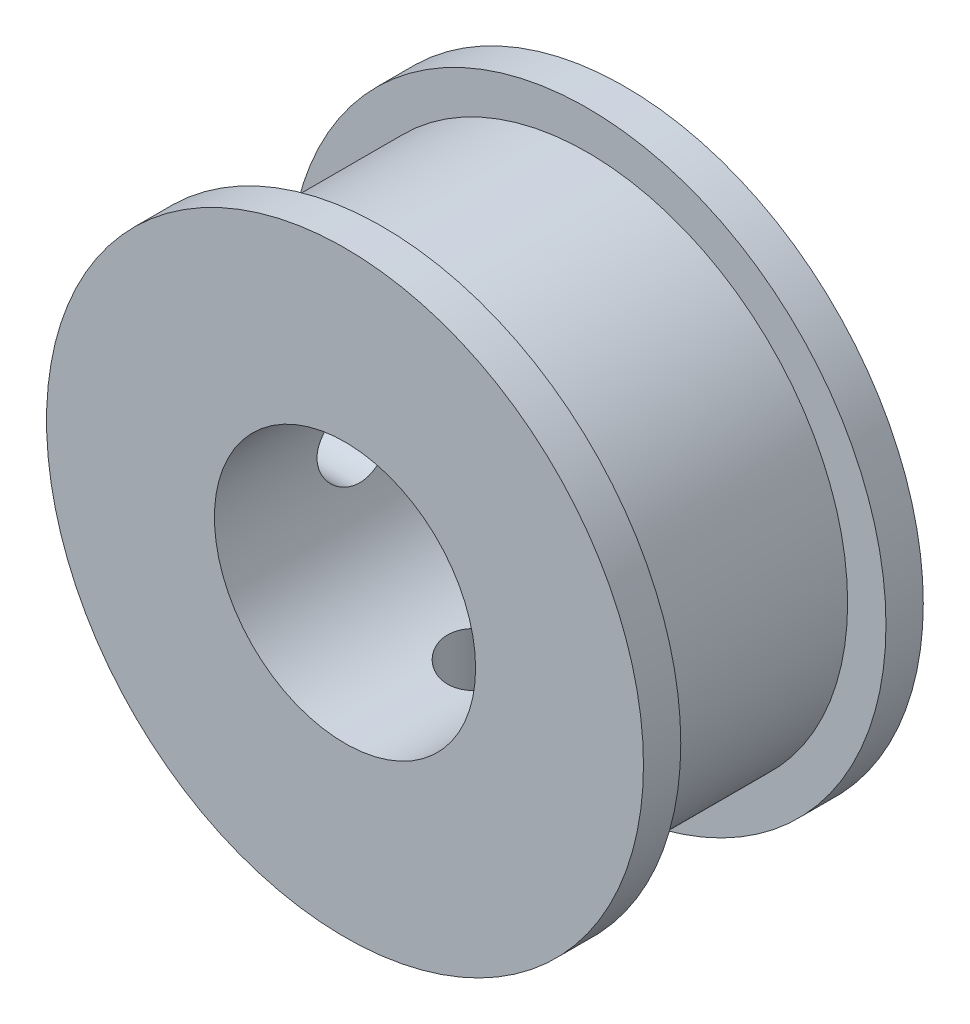
ISO-10303-21;
HEADER;
FILE_DESCRIPTION(('STEP AP214'),'2;1');
FILE_NAME('part.step','',(''),(''),'','','');
FILE_SCHEMA(('AUTOMOTIVE_DESIGN { 1 0 10303 214 1 1 1 1 }'));
ENDSEC;
DATA;
#1=APPLICATION_CONTEXT('core data for automotive mechanical design processes');
#2=APPLICATION_PROTOCOL_DEFINITION('international standard','automotive_design',2000,#1);
#3=PRODUCT_CONTEXT('',#1,'mechanical');
#4=PRODUCT('Part','Part','',(#3));
#5=PRODUCT_RELATED_PRODUCT_CATEGORY('part','',(#4));
#6=PRODUCT_DEFINITION_FORMATION('','',#4);
#7=PRODUCT_DEFINITION_CONTEXT('part definition',#1,'design');
#8=PRODUCT_DEFINITION('design','',#6,#7);
#9=PRODUCT_DEFINITION_SHAPE('','',#8);
#10=(LENGTH_UNIT() NAMED_UNIT(*) SI_UNIT(.MILLI.,.METRE.));
#11=(NAMED_UNIT(*) PLANE_ANGLE_UNIT() SI_UNIT($,.RADIAN.));
#12=(NAMED_UNIT(*) SI_UNIT($,.STERADIAN.) SOLID_ANGLE_UNIT());
#13=UNCERTAINTY_MEASURE_WITH_UNIT(LENGTH_MEASURE(1.E-05),#10,'distance_accuracy_value','');
#14=(GEOMETRIC_REPRESENTATION_CONTEXT(3) GLOBAL_UNCERTAINTY_ASSIGNED_CONTEXT((#13)) GLOBAL_UNIT_ASSIGNED_CONTEXT((#10,
#11,#12)) REPRESENTATION_CONTEXT('',''));
#15=CARTESIAN_POINT('',(0.,0.,0.));
#16=DIRECTION('',(0.,0.,1.));
#17=DIRECTION('',(1.,0.,0.));
#18=AXIS2_PLACEMENT_3D('',#15,#16,#17);
#19=CARTESIAN_POINT('',(0.,0.,2.));
#20=DIRECTION('',(0.,0.,-1.));
#21=DIRECTION('',(-1.,0.,0.));
#22=AXIS2_PLACEMENT_3D('',#19,#20,#21);
#23=CYLINDRICAL_SURFACE('',#22,16.);
#24=CARTESIAN_POINT('',(0.,0.,2.));
#25=DIRECTION('',(0.,0.,1.));
#26=DIRECTION('',(1.,0.,0.));
#27=AXIS2_PLACEMENT_3D('',#24,#25,#26);
#28=CIRCLE('',#27,16.);
#29=CARTESIAN_POINT('',(16.,0.,2.));
#30=VERTEX_POINT('',#29);
#31=EDGE_CURVE('E44',#30,#30,#28,.T.);
#32=ORIENTED_EDGE('',*,*,#31,.F.);
#33=EDGE_LOOP('',(#32));
#34=FACE_BOUND('',#33,.T.);
#35=CARTESIAN_POINT('',(0.,0.,0.));
#36=DIRECTION('',(0.,0.,1.));
#37=DIRECTION('',(1.,0.,0.));
#38=AXIS2_PLACEMENT_3D('',#35,#36,#37);
#39=CIRCLE('',#38,16.);
#40=CARTESIAN_POINT('',(16.,0.,0.));
#41=VERTEX_POINT('',#40);
#42=EDGE_CURVE('E49',#41,#41,#39,.T.);
#43=ORIENTED_EDGE('',*,*,#42,.T.);
#44=EDGE_LOOP('',(#43));
#45=FACE_BOUND('',#44,.T.);
#46=ADVANCED_FACE('F32',(#34,#45),#23,.T.);
#47=CARTESIAN_POINT('',(0.,0.,2.));
#48=DIRECTION('',(0.,0.,1.));
#49=DIRECTION('',(1.,0.,0.));
#50=AXIS2_PLACEMENT_3D('',#47,#48,#49);
#51=PLANE('',#50);
#52=CARTESIAN_POINT('',(0.,0.,2.));
#53=DIRECTION('',(0.,0.,1.));
#54=DIRECTION('',(1.,0.,0.));
#55=AXIS2_PLACEMENT_3D('',#52,#53,#54);
#56=CIRCLE('',#55,13.945);
#57=CARTESIAN_POINT('',(13.945,0.,2.));
#58=VERTEX_POINT('',#57);
#59=EDGE_CURVE('E10',#58,#58,#56,.T.);
#60=ORIENTED_EDGE('',*,*,#59,.F.);
#61=EDGE_LOOP('',(#60));
#62=FACE_BOUND('',#61,.T.);
#63=ORIENTED_EDGE('',*,*,#31,.T.);
#64=EDGE_LOOP('',(#63));
#65=FACE_BOUND('',#64,.T.);
#66=ADVANCED_FACE('F97',(#62,#65),#51,.T.);
#67=CARTESIAN_POINT('',(0.,0.,0.));
#68=DIRECTION('',(0.,0.,1.));
#69=DIRECTION('',(1.,0.,0.));
#70=AXIS2_PLACEMENT_3D('',#67,#68,#69);
#71=PLANE('',#70);
#72=CARTESIAN_POINT('',(0.,0.,0.));
#73=DIRECTION('',(0.,0.,1.));
#74=DIRECTION('',(1.,0.,0.));
#75=AXIS2_PLACEMENT_3D('',#72,#73,#74);
#76=CIRCLE('',#75,7.);
#77=CARTESIAN_POINT('',(7.,0.,0.));
#78=VERTEX_POINT('',#77);
#79=EDGE_CURVE('E86',#78,#78,#76,.T.);
#80=ORIENTED_EDGE('',*,*,#79,.T.);
#81=EDGE_LOOP('',(#80));
#82=FACE_BOUND('',#81,.T.);
#83=ORIENTED_EDGE('',*,*,#42,.F.);
#84=EDGE_LOOP('',(#83));
#85=FACE_BOUND('',#84,.T.);
#86=ADVANCED_FACE('F94',(#82,#85),#71,.F.);
#87=CARTESIAN_POINT('',(0.,0.,13.));
#88=DIRECTION('',(0.,0.,-1.));
#89=DIRECTION('',(-1.,0.,0.));
#90=AXIS2_PLACEMENT_3D('',#87,#88,#89);
#91=CYLINDRICAL_SURFACE('',#90,13.945);
#92=CARTESIAN_POINT('',(-13.945,0.,9.5));
#93=CARTESIAN_POINT('',(-13.9449982655467,-0.111725944881087,9.49999535043122));
#94=CARTESIAN_POINT('',(-13.9436431920022,-0.223518121905761,9.49060638937284));
#95=CARTESIAN_POINT('',(-13.9383679288523,-0.443981632184145,9.45330589604952));
#96=CARTESIAN_POINT('',(-13.9344451909274,-0.552649752951827,9.42537596210905));
#97=CARTESIAN_POINT('',(-13.9244757326362,-0.76364237886481,9.35184193419321));
#98=CARTESIAN_POINT('',(-13.9184305689848,-0.865971468897057,9.30625079148636));
#99=CARTESIAN_POINT('',(-13.9048854651112,-1.06151001299836,9.19871927063412));
#100=CARTESIAN_POINT('',(-13.897385740202,-1.15472081374425,9.13678131175586));
#101=CARTESIAN_POINT('',(-13.8817063382048,-1.3300616267768,8.99784094992483));
#102=CARTESIAN_POINT('',(-13.8735226128042,-1.41211682406785,8.92074457845407));
#103=CARTESIAN_POINT('',(-13.8574295164984,-1.5621720009626,8.75387800901321));
#104=CARTESIAN_POINT('',(-13.8495201608663,-1.63017119916254,8.66410710690485));
#105=CARTESIAN_POINT('',(-13.834831945192,-1.75047203324694,8.4739414372933));
#106=CARTESIAN_POINT('',(-13.8280583146169,-1.802701896444,8.37350082673225));
#107=CARTESIAN_POINT('',(-13.8164633174062,-1.88952287360959,8.16515971008703));
#108=CARTESIAN_POINT('',(-13.8116418535523,-1.9241148659692,8.05725957580174));
#109=CARTESIAN_POINT('',(-13.8045366341998,-1.97444713447729,7.83784652377838));
#110=CARTESIAN_POINT('',(-13.8022357044637,-1.99031504940842,7.72636345192361));
#111=CARTESIAN_POINT('',(-13.8003798364863,-2.00314401871672,7.50229496437047));
#112=CARTESIAN_POINT('',(-13.8008247539011,-2.00010606693928,7.38970960692779));
#113=CARTESIAN_POINT('',(-13.8043945997532,-1.97531397667889,7.167530664799));
#114=CARTESIAN_POINT('',(-13.8074992348458,-1.95370155530977,7.0579208935947));
#115=CARTESIAN_POINT('',(-13.8160070185916,-1.89259566227822,6.8438998341425));
#116=CARTESIAN_POINT('',(-13.8214102271404,-1.85310172466259,6.73948868143792));
#117=CARTESIAN_POINT('',(-13.8339289400293,-1.75720511736295,6.53839498345596));
#118=CARTESIAN_POINT('',(-13.8410505489524,-1.70074198532541,6.44174166675793));
#119=CARTESIAN_POINT('',(-13.8561991469752,-1.57255288207828,6.259227948228));
#120=CARTESIAN_POINT('',(-13.8642261904513,-1.50082599396734,6.17336819526388));
#121=CARTESIAN_POINT('',(-13.8803710383376,-1.34336543087744,6.01405715530256));
#122=CARTESIAN_POINT('',(-13.8884890021574,-1.2575098237008,5.94072634670625));
#123=CARTESIAN_POINT('',(-13.903832789545,-1.07464570955332,5.80949665037276));
#124=CARTESIAN_POINT('',(-13.9110586097879,-0.977637161018896,5.75159782014847));
#125=CARTESIAN_POINT('',(-13.9238105911513,-0.775119683667868,5.65287114178863));
#126=CARTESIAN_POINT('',(-13.9293358753501,-0.669606404455077,5.6120520973623));
#127=CARTESIAN_POINT('',(-13.9380567590545,-0.453125871305182,5.54874587133081));
#128=CARTESIAN_POINT('',(-13.9412525024255,-0.342158954619727,5.52625755766625));
#129=CARTESIAN_POINT('',(-13.9449352790098,-0.118961431261062,5.50041021912956));
#130=CARTESIAN_POINT('',(-13.9454457780248,-0.00675038897306506,5.49688546932927));
#131=CARTESIAN_POINT('',(-13.9437642773937,0.2166610480285,5.50862613849228));
#132=CARTESIAN_POINT('',(-13.9415723540364,0.32786147118233,5.52389102702867));
#133=CARTESIAN_POINT('',(-13.9347468235621,0.545596751155939,5.57263987951943));
#134=CARTESIAN_POINT('',(-13.9301239754049,0.65214994333569,5.60604358451257));
#135=CARTESIAN_POINT('',(-13.9189534759039,0.858143112440643,5.69003756030219));
#136=CARTESIAN_POINT('',(-13.9124057409701,0.957582780220601,5.74062857749002));
#137=CARTESIAN_POINT('',(-13.8980553366504,1.1472581199749,5.85795328605779));
#138=CARTESIAN_POINT('',(-13.8902445663647,1.23742778076889,5.92479268699532));
#139=CARTESIAN_POINT('',(-13.874264016036,1.4053289588581,6.0725690039025));
#140=CARTESIAN_POINT('',(-13.8660942170238,1.48305981794751,6.15350666541614));
#141=CARTESIAN_POINT('',(-13.8502425418994,1.6244757275981,6.32791763946523));
#142=CARTESIAN_POINT('',(-13.8425648264667,1.68805002357053,6.4214811890343));
#143=CARTESIAN_POINT('',(-13.8286388613517,1.79857964993521,6.61805623292917));
#144=CARTESIAN_POINT('',(-13.82239057571,1.84553539840802,6.72106748949248));
#145=CARTESIAN_POINT('',(-13.8120605902263,1.92132120964418,6.93327600223782));
#146=CARTESIAN_POINT('',(-13.8079717917124,1.95021071817875,7.04245166795921));
#147=CARTESIAN_POINT('',(-13.8024044544715,1.98923385843402,7.26416789677154));
#148=CARTESIAN_POINT('',(-13.8009257522239,1.99936866512387,7.37670824861832));
#149=CARTESIAN_POINT('',(-13.800751775432,2.00056854479561,7.60085595836024));
#150=CARTESIAN_POINT('',(-13.8020310901411,1.9918077107637,7.71246240387671));
#151=CARTESIAN_POINT('',(-13.8071739433262,1.95583683286525,7.93259771515098));
#152=CARTESIAN_POINT('',(-13.8110374790295,1.92862680879322,8.04112658421065));
#153=CARTESIAN_POINT('',(-13.8209048536763,1.85658955692229,8.25198480629022));
#154=CARTESIAN_POINT('',(-13.8269073413472,1.81177344985481,8.35431802574034));
#155=CARTESIAN_POINT('',(-13.8403780835011,1.70581339864733,8.55004085937553));
#156=CARTESIAN_POINT('',(-13.8478463789721,1.64466899790683,8.64343022335753));
#157=CARTESIAN_POINT('',(-13.8634893350983,1.50715159888151,8.81950052775766));
#158=CARTESIAN_POINT('',(-13.8716696306741,1.43064939160746,8.90208006101393));
#159=CARTESIAN_POINT('',(-13.8877670585951,1.26486070627031,9.05329221879918));
#160=CARTESIAN_POINT('',(-13.8956841291144,1.17557125053641,9.12192158582665));
#161=CARTESIAN_POINT('',(-13.9104080620764,0.986219027398785,9.24358924430717));
#162=CARTESIAN_POINT('',(-13.9172091614366,0.886104508435573,9.29654767147628));
#163=CARTESIAN_POINT('',(-13.9288779866587,0.678354067742358,9.38482020004785));
#164=CARTESIAN_POINT('',(-13.9337477415888,0.570726180147766,9.420152829212));
#165=CARTESIAN_POINT('',(-13.9398759727421,0.385494842989387,9.46403022878396));
#166=CARTESIAN_POINT('',(-13.9417877583291,0.309042203670669,9.47749862894637));
#167=CARTESIAN_POINT('',(-13.9443503670583,0.155070338741732,9.49548507955022));
#168=CARTESIAN_POINT('',(-13.9450012039173,0.0775511247432515,9.50000322735501));
#169=CARTESIAN_POINT('',(-13.945,0.,9.5));
#170=B_SPLINE_CURVE_WITH_KNOTS('',3,(#92,#93,#94,#95,#96,#97,#98,#99,#100,#101,#102,#103,#104,
#105,#106,#107,#108,#109,#110,#111,#112,#113,#114,#115,#116,#117,#118,#119,#120,#121,#122,#123,
#124,#125,#126,#127,#128,#129,#130,#131,#132,#133,#134,#135,#136,#137,#138,#139,#140,#141,#142,
#143,#144,#145,#146,#147,#148,#149,#150,#151,#152,#153,#154,#155,#156,#157,#158,#159,#160,#161,
#162,#163,#164,#165,#166,#167,#168,#169),.UNSPECIFIED.,.T.,.F.,(4,2,2,2,2,2,2,2,2,2,2,2,2,2,2,2,
2,2,2,2,2,2,2,2,2,2,2,2,2,2,2,2,2,2,2,2,2,2,4),(0.,0.334894486280671,0.670121848927922,
1.00510384751603,1.34003629780493,1.6771144996819,2.01421143543773,2.35282027784864,
2.69141225540951,3.02768252571801,3.36393511908837,3.69764476266522,4.03136310248575,
4.36628489115792,4.70122680442871,5.03922750672538,5.37722946868748,5.71540543846661,
6.05356052177335,6.38875556748366,6.72394115093624,7.05765557953602,7.39138450216532,
7.72734562512789,8.06332451977787,8.40184618887145,8.74035934101194,9.07775269481334,
9.41512491043806,9.74940206946978,10.0836788698493,10.4177448657622,10.7518202043955,
11.0888338092082,11.425926019848,11.764707691787,12.1031324912221,12.335591716681,
12.5680484133688),.UNSPECIFIED.);
#171=CARTESIAN_POINT('',(-13.945,0.,9.5));
#172=VERTEX_POINT('',#171);
#173=EDGE_CURVE('E63',#172,#172,#170,.T.);
#174=ORIENTED_EDGE('',*,*,#173,.T.);
#175=EDGE_LOOP('',(#174));
#176=FACE_BOUND('',#175,.T.);
#177=CARTESIAN_POINT('',(0.,-13.945,9.5));
#178=CARTESIAN_POINT('',(0.111725944881087,-13.9449982655467,9.49999535043122));
#179=CARTESIAN_POINT('',(0.223518121905761,-13.9436431920022,9.49060638937284));
#180=CARTESIAN_POINT('',(0.443981632184145,-13.9383679288523,9.45330589604952));
#181=CARTESIAN_POINT('',(0.552649752951827,-13.9344451909274,9.42537596210905));
#182=CARTESIAN_POINT('',(0.763642378864811,-13.9244757326362,9.35184193419321));
#183=CARTESIAN_POINT('',(0.865971468897056,-13.9184305689848,9.30625079148636));
#184=CARTESIAN_POINT('',(1.06151001299836,-13.9048854651112,9.19871927063412));
#185=CARTESIAN_POINT('',(1.15472081374425,-13.897385740202,9.13678131175586));
#186=CARTESIAN_POINT('',(1.3300616267768,-13.8817063382048,8.99784094992483));
#187=CARTESIAN_POINT('',(1.41211682406784,-13.8735226128042,8.92074457845407));
#188=CARTESIAN_POINT('',(1.5621720009626,-13.8574295164984,8.75387800901321));
#189=CARTESIAN_POINT('',(1.63017119916254,-13.8495201608663,8.66410710690485));
#190=CARTESIAN_POINT('',(1.75047203324694,-13.834831945192,8.4739414372933));
#191=CARTESIAN_POINT('',(1.802701896444,-13.8280583146169,8.37350082673225));
#192=CARTESIAN_POINT('',(1.88952287360959,-13.8164633174062,8.16515971008703));
#193=CARTESIAN_POINT('',(1.9241148659692,-13.8116418535523,8.05725957580175));
#194=CARTESIAN_POINT('',(1.97444713447729,-13.8045366341998,7.83784652377838));
#195=CARTESIAN_POINT('',(1.99031504940842,-13.8022357044637,7.72636345192361));
#196=CARTESIAN_POINT('',(2.00314401871672,-13.8003798364863,7.50229496437047));
#197=CARTESIAN_POINT('',(2.00010606693928,-13.8008247539011,7.38970960692779));
#198=CARTESIAN_POINT('',(1.97531397667889,-13.8043945997532,7.167530664799));
#199=CARTESIAN_POINT('',(1.95370155530977,-13.8074992348458,7.0579208935947));
#200=CARTESIAN_POINT('',(1.89259566227822,-13.8160070185916,6.8438998341425));
#201=CARTESIAN_POINT('',(1.85310172466259,-13.8214102271404,6.73948868143792));
#202=CARTESIAN_POINT('',(1.75720511736295,-13.8339289400293,6.53839498345596));
#203=CARTESIAN_POINT('',(1.70074198532541,-13.8410505489524,6.44174166675793));
#204=CARTESIAN_POINT('',(1.57255288207828,-13.8561991469752,6.259227948228));
#205=CARTESIAN_POINT('',(1.50082599396734,-13.8642261904513,6.17336819526388));
#206=CARTESIAN_POINT('',(1.34336543087744,-13.8803710383376,6.01405715530256));
#207=CARTESIAN_POINT('',(1.2575098237008,-13.8884890021574,5.94072634670625));
#208=CARTESIAN_POINT('',(1.07464570955332,-13.903832789545,5.80949665037276));
#209=CARTESIAN_POINT('',(0.977637161018895,-13.9110586097879,5.75159782014847));
#210=CARTESIAN_POINT('',(0.775119683667867,-13.9238105911513,5.65287114178863));
#211=CARTESIAN_POINT('',(0.669606404455077,-13.9293358753501,5.6120520973623));
#212=CARTESIAN_POINT('',(0.453125871305181,-13.9380567590545,5.54874587133081));
#213=CARTESIAN_POINT('',(0.342158954619726,-13.9412525024255,5.52625755766625));
#214=CARTESIAN_POINT('',(0.118961431261061,-13.9449352790098,5.50041021912956));
#215=CARTESIAN_POINT('',(0.00675038897306411,-13.9454457780248,5.49688546932927));
#216=CARTESIAN_POINT('',(-0.216661048028501,-13.9437642773937,5.50862613849228));
#217=CARTESIAN_POINT('',(-0.32786147118233,-13.9415723540364,5.52389102702867));
#218=CARTESIAN_POINT('',(-0.545596751155938,-13.9347468235621,5.57263987951943));
#219=CARTESIAN_POINT('',(-0.652149943335689,-13.9301239754049,5.60604358451257));
#220=CARTESIAN_POINT('',(-0.858143112440642,-13.9189534759039,5.69003756030219));
#221=CARTESIAN_POINT('',(-0.9575827802206,-13.9124057409701,5.74062857749002));
#222=CARTESIAN_POINT('',(-1.1472581199749,-13.8980553366504,5.85795328605779));
#223=CARTESIAN_POINT('',(-1.23742778076889,-13.8902445663647,5.92479268699532));
#224=CARTESIAN_POINT('',(-1.4053289588581,-13.874264016036,6.0725690039025));
#225=CARTESIAN_POINT('',(-1.48305981794751,-13.8660942170238,6.15350666541614));
#226=CARTESIAN_POINT('',(-1.6244757275981,-13.8502425418994,6.32791763946523));
#227=CARTESIAN_POINT('',(-1.68805002357053,-13.8425648264667,6.4214811890343));
#228=CARTESIAN_POINT('',(-1.79857964993521,-13.8286388613517,6.61805623292917));
#229=CARTESIAN_POINT('',(-1.84553539840802,-13.82239057571,6.72106748949248));
#230=CARTESIAN_POINT('',(-1.92132120964418,-13.8120605902263,6.93327600223782));
#231=CARTESIAN_POINT('',(-1.95021071817875,-13.8079717917124,7.04245166795921));
#232=CARTESIAN_POINT('',(-1.98923385843402,-13.8024044544715,7.26416789677155));
#233=CARTESIAN_POINT('',(-1.99936866512387,-13.8009257522239,7.37670824861832));
#234=CARTESIAN_POINT('',(-2.00056854479561,-13.800751775432,7.60085595836024));
#235=CARTESIAN_POINT('',(-1.9918077107637,-13.8020310901411,7.71246240387671));
#236=CARTESIAN_POINT('',(-1.95583683286525,-13.8071739433262,7.93259771515098));
#237=CARTESIAN_POINT('',(-1.92862680879322,-13.8110374790295,8.04112658421065));
#238=CARTESIAN_POINT('',(-1.85658955692229,-13.8209048536763,8.25198480629022));
#239=CARTESIAN_POINT('',(-1.81177344985481,-13.8269073413472,8.35431802574033));
#240=CARTESIAN_POINT('',(-1.70581339864734,-13.8403780835011,8.55004085937553));
#241=CARTESIAN_POINT('',(-1.64466899790683,-13.8478463789721,8.64343022335753));
#242=CARTESIAN_POINT('',(-1.50715159888151,-13.8634893350983,8.81950052775766));
#243=CARTESIAN_POINT('',(-1.43064939160746,-13.8716696306741,8.90208006101393));
#244=CARTESIAN_POINT('',(-1.26486070627031,-13.8877670585951,9.05329221879918));
#245=CARTESIAN_POINT('',(-1.17557125053641,-13.8956841291144,9.12192158582665));
#246=CARTESIAN_POINT('',(-0.986219027398784,-13.9104080620764,9.24358924430717));
#247=CARTESIAN_POINT('',(-0.886104508435573,-13.9172091614366,9.29654767147628));
#248=CARTESIAN_POINT('',(-0.678354067742358,-13.9288779866587,9.38482020004785));
#249=CARTESIAN_POINT('',(-0.570726180147766,-13.9337477415888,9.420152829212));
#250=CARTESIAN_POINT('',(-0.385494842989387,-13.9398759727421,9.46403022878395));
#251=CARTESIAN_POINT('',(-0.309042203670669,-13.9417877583291,9.47749862894637));
#252=CARTESIAN_POINT('',(-0.155070338741732,-13.9443503670583,9.49548507955022));
#253=CARTESIAN_POINT('',(-0.0775511247432517,-13.9450012039173,9.50000322735501));
#254=CARTESIAN_POINT('',(0.,-13.945,9.5));
#255=B_SPLINE_CURVE_WITH_KNOTS('',3,(#177,#178,#179,#180,#181,#182,#183,#184,#185,#186,#187,
#188,#189,#190,#191,#192,#193,#194,#195,#196,#197,#198,#199,#200,#201,#202,#203,#204,#205,#206,
#207,#208,#209,#210,#211,#212,#213,#214,#215,#216,#217,#218,#219,#220,#221,#222,#223,#224,#225,
#226,#227,#228,#229,#230,#231,#232,#233,#234,#235,#236,#237,#238,#239,#240,#241,#242,#243,#244,
#245,#246,#247,#248,#249,#250,#251,#252,#253,#254),.UNSPECIFIED.,.T.,.F.,(4,2,2,2,2,2,2,2,2,2,2,
2,2,2,2,2,2,2,2,2,2,2,2,2,2,2,2,2,2,2,2,2,2,2,2,2,2,2,4),(0.,0.334894486280671,
0.670121848927922,1.00510384751603,1.34003629780493,1.6771144996819,2.01421143543773,
2.35282027784864,2.69141225540951,3.02768252571801,3.36393511908837,3.69764476266522,
4.03136310248575,4.36628489115792,4.70122680442871,5.03922750672538,5.37722946868748,
5.71540543846661,6.05356052177335,6.38875556748366,6.72394115093624,7.05765557953602,
7.39138450216532,7.72734562512789,8.06332451977787,8.40184618887145,8.74035934101194,
9.07775269481334,9.41512491043806,9.74940206946978,10.0836788698493,10.4177448657622,
10.7518202043955,11.0888338092082,11.425926019848,11.764707691787,12.1031324912221,
12.335591716681,12.5680484133688),.UNSPECIFIED.);
#256=CARTESIAN_POINT('',(0.,-13.945,9.5));
#257=VERTEX_POINT('',#256);
#258=EDGE_CURVE('E62',#257,#257,#255,.T.);
#259=ORIENTED_EDGE('',*,*,#258,.T.);
#260=EDGE_LOOP('',(#259));
#261=FACE_BOUND('',#260,.T.);
#262=CARTESIAN_POINT('',(0.,0.,13.));
#263=DIRECTION('',(0.,0.,1.));
#264=DIRECTION('',(1.,0.,0.));
#265=AXIS2_PLACEMENT_3D('',#262,#263,#264);
#266=CIRCLE('',#265,13.945);
#267=CARTESIAN_POINT('',(13.945,0.,13.));
#268=VERTEX_POINT('',#267);
#269=EDGE_CURVE('E52',#268,#268,#266,.T.);
#270=ORIENTED_EDGE('',*,*,#269,.F.);
#271=EDGE_LOOP('',(#270));
#272=FACE_BOUND('',#271,.T.);
#273=ORIENTED_EDGE('',*,*,#59,.T.);
#274=EDGE_LOOP('',(#273));
#275=FACE_BOUND('',#274,.T.);
#276=ADVANCED_FACE('F88',(#176,#261,#272,#275),#91,.T.);
#277=CARTESIAN_POINT('',(0.,0.,15.));
#278=DIRECTION('',(0.,0.,-1.));
#279=DIRECTION('',(-1.,0.,0.));
#280=AXIS2_PLACEMENT_3D('',#277,#278,#279);
#281=CYLINDRICAL_SURFACE('',#280,16.);
#282=CARTESIAN_POINT('',(0.,0.,15.));
#283=DIRECTION('',(0.,0.,1.));
#284=DIRECTION('',(1.,0.,0.));
#285=AXIS2_PLACEMENT_3D('',#282,#283,#284);
#286=CIRCLE('',#285,16.);
#287=CARTESIAN_POINT('',(16.,0.,15.));
#288=VERTEX_POINT('',#287);
#289=EDGE_CURVE('E195',#288,#288,#286,.T.);
#290=ORIENTED_EDGE('',*,*,#289,.F.);
#291=EDGE_LOOP('',(#290));
#292=FACE_BOUND('',#291,.T.);
#293=CARTESIAN_POINT('',(0.,0.,13.));
#294=DIRECTION('',(0.,0.,1.));
#295=DIRECTION('',(1.,0.,0.));
#296=AXIS2_PLACEMENT_3D('',#293,#294,#295);
#297=CIRCLE('',#296,16.);
#298=CARTESIAN_POINT('',(16.,0.,13.));
#299=VERTEX_POINT('',#298);
#300=EDGE_CURVE('E193',#299,#299,#297,.T.);
#301=ORIENTED_EDGE('',*,*,#300,.T.);
#302=EDGE_LOOP('',(#301));
#303=FACE_BOUND('',#302,.T.);
#304=ADVANCED_FACE('F93',(#292,#303),#281,.T.);
#305=CARTESIAN_POINT('',(0.,0.,15.));
#306=DIRECTION('',(0.,0.,1.));
#307=DIRECTION('',(1.,0.,0.));
#308=AXIS2_PLACEMENT_3D('',#305,#306,#307);
#309=PLANE('',#308);
#310=CARTESIAN_POINT('',(0.,0.,15.));
#311=DIRECTION('',(0.,0.,1.));
#312=DIRECTION('',(1.,0.,0.));
#313=AXIS2_PLACEMENT_3D('',#310,#311,#312);
#314=CIRCLE('',#313,7.);
#315=CARTESIAN_POINT('',(7.,0.,15.));
#316=VERTEX_POINT('',#315);
#317=EDGE_CURVE('E82',#316,#316,#314,.T.);
#318=ORIENTED_EDGE('',*,*,#317,.F.);
#319=EDGE_LOOP('',(#318));
#320=FACE_BOUND('',#319,.T.);
#321=ORIENTED_EDGE('',*,*,#289,.T.);
#322=EDGE_LOOP('',(#321));
#323=FACE_BOUND('',#322,.T.);
#324=ADVANCED_FACE('F129',(#320,#323),#309,.T.);
#325=CARTESIAN_POINT('',(0.,0.,13.));
#326=DIRECTION('',(0.,0.,1.));
#327=DIRECTION('',(1.,0.,0.));
#328=AXIS2_PLACEMENT_3D('',#325,#326,#327);
#329=PLANE('',#328);
#330=ORIENTED_EDGE('',*,*,#269,.T.);
#331=EDGE_LOOP('',(#330));
#332=FACE_BOUND('',#331,.T.);
#333=ORIENTED_EDGE('',*,*,#300,.F.);
#334=EDGE_LOOP('',(#333));
#335=FACE_BOUND('',#334,.T.);
#336=ADVANCED_FACE('F137',(#332,#335),#329,.F.);
#337=CARTESIAN_POINT('',(0.,0.,0.));
#338=DIRECTION('',(0.,0.,1.));
#339=DIRECTION('',(1.,0.,0.));
#340=AXIS2_PLACEMENT_3D('',#337,#338,#339);
#341=CYLINDRICAL_SURFACE('',#340,7.);
#342=CARTESIAN_POINT('',(-7.,0.,5.5));
#343=CARTESIAN_POINT('',(-6.99999869294341,-0.109954902377251,5.50000193956195));
#344=CARTESIAN_POINT('',(-6.99738417402043,-0.219929747872582,5.50909778897611));
#345=CARTESIAN_POINT('',(-6.98720905945103,-0.436691991196989,5.54516427010231));
#346=CARTESIAN_POINT('',(-6.97964659210084,-0.543478166829615,5.57214166607409));
#347=CARTESIAN_POINT('',(-6.96040691349073,-0.750704300737871,5.6430080384165));
#348=CARTESIAN_POINT('',(-6.94873544106341,-0.851152880848224,5.68687343615195));
#349=CARTESIAN_POINT('',(-6.92249978316544,-1.04326876112927,5.79017799147835));
#350=CARTESIAN_POINT('',(-6.90793529508022,-1.13493514117816,5.84961877849036));
#351=CARTESIAN_POINT('',(-6.8770473462558,-1.30929444685894,5.98403501067291));
#352=CARTESIAN_POINT('',(-6.86069041945191,-1.39172372238094,6.05934475385527));
#353=CARTESIAN_POINT('',(-6.82826734915641,-1.54297135792435,6.22264774313768));
#354=CARTESIAN_POINT('',(-6.81220124959344,-1.61178767707782,6.31064288763223));
#355=CARTESIAN_POINT('',(-6.78183014875388,-1.7351979000643,6.49899358279091));
#356=CARTESIAN_POINT('',(-6.76756702506018,-1.78947821103348,6.59956198506486));
#357=CARTESIAN_POINT('',(-6.74291343840667,-1.8802517055398,6.80887201175076));
#358=CARTESIAN_POINT('',(-6.73252214244871,-1.91674871555719,6.91761187207089));
#359=CARTESIAN_POINT('',(-6.71713608196016,-1.96998433013875,7.13723476316554));
#360=CARTESIAN_POINT('',(-6.71200978570011,-1.9872055320285,7.24799136276783));
#361=CARTESIAN_POINT('',(-6.70734208201995,-2.00290667789184,7.4709311484461));
#362=CARTESIAN_POINT('',(-6.70779946107612,-2.00139069409621,7.58311401925022));
#363=CARTESIAN_POINT('',(-6.71413034409934,-1.98004134762903,7.80186861145616));
#364=CARTESIAN_POINT('',(-6.71982782697936,-1.96080325728391,7.90850435118076));
#365=CARTESIAN_POINT('',(-6.73571348382811,-1.90551386085789,8.1169672196276));
#366=CARTESIAN_POINT('',(-6.74590206376403,-1.8694610348125,8.2187939127205));
#367=CARTESIAN_POINT('',(-6.7697686351608,-1.78110681137812,8.41624624443181));
#368=CARTESIAN_POINT('',(-6.78348916405649,-1.72860551172881,8.51177707240167));
#369=CARTESIAN_POINT('',(-6.81285216882059,-1.60898379167885,8.69287656121341));
#370=CARTESIAN_POINT('',(-6.82849507221912,-1.54186011673345,8.77844299773491));
#371=CARTESIAN_POINT('',(-6.86066250656356,-1.39190399673021,8.94057237560637));
#372=CARTESIAN_POINT('',(-6.87719804572366,-1.30857487484533,9.01667447596723));
#373=CARTESIAN_POINT('',(-6.90876247218345,-1.13013228238622,9.15392600364028));
#374=CARTESIAN_POINT('',(-6.92379128137825,-1.03501820148189,9.21507465604171));
#375=CARTESIAN_POINT('',(-6.95076528065502,-0.834923073091444,9.32092873477404));
#376=CARTESIAN_POINT('',(-6.96269275497229,-0.729889817810004,9.36554028680419));
#377=CARTESIAN_POINT('',(-6.98199251487585,-0.513393229967469,9.43633389141682));
#378=CARTESIAN_POINT('',(-6.98936594856255,-0.401931525810146,9.46252058924527));
#379=CARTESIAN_POINT('',(-6.99854874514672,-0.17966638864435,9.49497328570945));
#380=CARTESIAN_POINT('',(-7.00053272850599,-0.0689613468605083,9.50186469537303));
#381=CARTESIAN_POINT('',(-6.99922084707091,0.152026526805583,9.49727273369896));
#382=CARTESIAN_POINT('',(-6.99592561580629,0.262309407757108,9.48579156715408));
#383=CARTESIAN_POINT('',(-6.98453926685206,0.477018633430315,9.44528955568375));
#384=CARTESIAN_POINT('',(-6.97654613017679,0.581518211734843,9.41662681867661));
#385=CARTESIAN_POINT('',(-6.95667998741883,0.784208686205641,9.34299949801533));
#386=CARTESIAN_POINT('',(-6.94480653265874,0.882398851248718,9.29803302911067));
#387=CARTESIAN_POINT('',(-6.91809961169145,1.07204168512003,9.19197666335488));
#388=CARTESIAN_POINT('',(-6.9032076317834,1.16330248654009,9.13055880117467));
#389=CARTESIAN_POINT('',(-6.87217947098441,1.33443852805947,8.9937474940489));
#390=CARTESIAN_POINT('',(-6.85604300755107,1.41431117084304,8.91835086993543));
#391=CARTESIAN_POINT('',(-6.82368619629443,1.56310642834007,8.75279065795056));
#392=CARTESIAN_POINT('',(-6.80748036858305,1.63158542740713,8.66222472444096));
#393=CARTESIAN_POINT('',(-6.77738894734787,1.75239531606757,8.47053741137533));
#394=CARTESIAN_POINT('',(-6.76350327310608,1.8047267674867,8.36941639922874));
#395=CARTESIAN_POINT('',(-6.73978651242836,1.89137454118278,8.15990878902478));
#396=CARTESIAN_POINT('',(-6.72993400029434,1.92578633239654,8.05156423650238));
#397=CARTESIAN_POINT('',(-6.71542456669526,1.9757945006787,7.83029006442521));
#398=CARTESIAN_POINT('',(-6.71076607094366,1.99139657901587,7.71736184492359));
#399=CARTESIAN_POINT('',(-6.70731703127619,2.00298024246851,7.49470396706322));
#400=CARTESIAN_POINT('',(-6.70831160808103,1.99968027644405,7.38501449544334));
#401=CARTESIAN_POINT('',(-6.71554597206102,1.97524710957466,7.16782526933831));
#402=CARTESIAN_POINT('',(-6.72178558421114,1.95411450379873,7.06032544190808));
#403=CARTESIAN_POINT('',(-6.73866977160527,1.89505968816675,6.8516216288314));
#404=CARTESIAN_POINT('',(-6.74926877048974,1.85731091786365,6.75036461298883));
#405=CARTESIAN_POINT('',(-6.77367302842112,1.76622949301581,6.55554126550781));
#406=CARTESIAN_POINT('',(-6.78747885482392,1.71289408043152,6.46197629872677));
#407=CARTESIAN_POINT('',(-6.81731668949935,1.59006546534828,6.28181647819467));
#408=CARTESIAN_POINT('',(-6.83340763179064,1.52009227722732,6.19555860865804));
#409=CARTESIAN_POINT('',(-6.86569845092232,1.36685984037935,6.03577610419019));
#410=CARTESIAN_POINT('',(-6.88189835417168,1.28359725072856,5.9622546808892));
#411=CARTESIAN_POINT('',(-6.91307959572365,1.10357432086539,5.82816281567338));
#412=CARTESIAN_POINT('',(-6.92801901037413,1.00652250235978,5.76797301273037));
#413=CARTESIAN_POINT('',(-6.95451395777971,0.803250529646661,5.66485421497799));
#414=CARTESIAN_POINT('',(-6.96607133870287,0.697035424114739,5.62191578806694));
#415=CARTESIAN_POINT('',(-6.98327344725308,0.492916315335035,5.55915244860455));
#416=CARTESIAN_POINT('',(-6.98949684362076,0.395763007624391,5.53702646331544));
#417=CARTESIAN_POINT('',(-6.99786043852147,0.199078368786368,5.50745034275786));
#418=CARTESIAN_POINT('',(-7.00000118333996,0.0995473576160921,5.49999824402312));
#419=CARTESIAN_POINT('',(-7.,0.,5.5));
#420=B_SPLINE_CURVE_WITH_KNOTS('',3,(#342,#343,#344,#345,#346,#347,#348,#349,#350,#351,#352,
#353,#354,#355,#356,#357,#358,#359,#360,#361,#362,#363,#364,#365,#366,#367,#368,#369,#370,#371,
#372,#373,#374,#375,#376,#377,#378,#379,#380,#381,#382,#383,#384,#385,#386,#387,#388,#389,#390,
#391,#392,#393,#394,#395,#396,#397,#398,#399,#400,#401,#402,#403,#404,#405,#406,#407,#408,#409,
#410,#411,#412,#413,#414,#415,#416,#417,#418,#419),.UNSPECIFIED.,.T.,.F.,(4,2,2,2,2,2,2,2,2,2,2,
2,2,2,2,2,2,2,2,2,2,2,2,2,2,2,2,2,2,2,2,2,2,2,2,2,2,2,4),(0.,0.329499312542344,0.65912333979518,
0.988288812895343,1.31748873543516,1.65447811530781,1.99151797873713,2.33533075300057,
2.67906951544809,3.0139950986275,3.34884789231233,3.67284785829333,3.99687711786126,
4.3250080329121,4.65321205577343,4.99378500602502,5.33437560155449,5.67687101104449,
6.01928004014612,6.35045457698201,6.68158937434649,7.0060514047952,7.33055096575529,
7.66207525344452,7.99367503187788,8.33612104884334,8.67855514965298,9.01914573366139,
9.35963305787734,9.68726681616472,10.0148896418598,10.3391709629126,10.6635096999758,
10.9986765689036,11.3339278310847,11.6777797897016,12.0214434923409,12.3197946803794,
12.6181059442772),.UNSPECIFIED.);
#421=CARTESIAN_POINT('',(-7.,0.,5.5));
#422=VERTEX_POINT('',#421);
#423=EDGE_CURVE('E35',#422,#422,#420,.T.);
#424=ORIENTED_EDGE('',*,*,#423,.T.);
#425=EDGE_LOOP('',(#424));
#426=FACE_BOUND('',#425,.T.);
#427=CARTESIAN_POINT('',(0.,-7.,9.5));
#428=CARTESIAN_POINT('',(-0.109954902377251,-6.99999869294341,9.49999806043805));
#429=CARTESIAN_POINT('',(-0.219929747872582,-6.99738417402043,9.49090221102388));
#430=CARTESIAN_POINT('',(-0.436691991196989,-6.98720905945103,9.45483572989769));
#431=CARTESIAN_POINT('',(-0.543478166829616,-6.97964659210084,9.42785833392591));
#432=CARTESIAN_POINT('',(-0.750704300737871,-6.96040691349073,9.35699196158349));
#433=CARTESIAN_POINT('',(-0.851152880848224,-6.94873544106341,9.31312656384805));
#434=CARTESIAN_POINT('',(-1.04326876112927,-6.92249978316544,9.20982200852165));
#435=CARTESIAN_POINT('',(-1.13493514117817,-6.90793529508022,9.15038122150964));
#436=CARTESIAN_POINT('',(-1.30929444685895,-6.8770473462558,9.01596498932709));
#437=CARTESIAN_POINT('',(-1.39172372238094,-6.86069041945191,8.94065524614473));
#438=CARTESIAN_POINT('',(-1.54297135792435,-6.82826734915641,8.77735225686232));
#439=CARTESIAN_POINT('',(-1.61178767707782,-6.81220124959344,8.68935711236777));
#440=CARTESIAN_POINT('',(-1.7351979000643,-6.78183014875388,8.50100641720909));
#441=CARTESIAN_POINT('',(-1.78947821103348,-6.76756702506018,8.40043801493514));
#442=CARTESIAN_POINT('',(-1.8802517055398,-6.74291343840667,8.19112798824924));
#443=CARTESIAN_POINT('',(-1.91674871555719,-6.73252214244871,8.08238812792911));
#444=CARTESIAN_POINT('',(-1.96998433013875,-6.71713608196016,7.86276523683446));
#445=CARTESIAN_POINT('',(-1.9872055320285,-6.71200978570011,7.75200863723217));
#446=CARTESIAN_POINT('',(-2.00290667789184,-6.70734208201995,7.5290688515539));
#447=CARTESIAN_POINT('',(-2.00139069409621,-6.70779946107612,7.41688598074978));
#448=CARTESIAN_POINT('',(-1.98004134762903,-6.71413034409934,7.19813138854384));
#449=CARTESIAN_POINT('',(-1.96080325728391,-6.71982782697936,7.09149564881924));
#450=CARTESIAN_POINT('',(-1.90551386085789,-6.73571348382811,6.8830327803724));
#451=CARTESIAN_POINT('',(-1.8694610348125,-6.74590206376403,6.7812060872795));
#452=CARTESIAN_POINT('',(-1.78110681137812,-6.7697686351608,6.58375375556819));
#453=CARTESIAN_POINT('',(-1.72860551172881,-6.78348916405649,6.48822292759833));
#454=CARTESIAN_POINT('',(-1.60898379167885,-6.81285216882059,6.30712343878659));
#455=CARTESIAN_POINT('',(-1.54186011673345,-6.82849507221912,6.22155700226509));
#456=CARTESIAN_POINT('',(-1.39190399673021,-6.86066250656356,6.05942762439363));
#457=CARTESIAN_POINT('',(-1.30857487484533,-6.87719804572366,5.98332552403277));
#458=CARTESIAN_POINT('',(-1.13013228238622,-6.90876247218345,5.84607399635972));
#459=CARTESIAN_POINT('',(-1.03501820148189,-6.92379128137825,5.78492534395829));
#460=CARTESIAN_POINT('',(-0.834923073091445,-6.95076528065502,5.67907126522596));
#461=CARTESIAN_POINT('',(-0.729889817810004,-6.96269275497229,5.63445971319581));
#462=CARTESIAN_POINT('',(-0.513393229967468,-6.98199251487585,5.56366610858318));
#463=CARTESIAN_POINT('',(-0.401931525810145,-6.98936594856255,5.53747941075473));
#464=CARTESIAN_POINT('',(-0.179666388644349,-6.99854874514672,5.50502671429055));
#465=CARTESIAN_POINT('',(-0.068961346860507,-7.00053272850599,5.49813530462697));
#466=CARTESIAN_POINT('',(0.152026526805584,-6.99922084707091,5.50272726630104));
#467=CARTESIAN_POINT('',(0.262309407757109,-6.99592561580629,5.51420843284592));
#468=CARTESIAN_POINT('',(0.477018633430316,-6.98453926685206,5.55471044431625));
#469=CARTESIAN_POINT('',(0.581518211734844,-6.97654613017679,5.58337318132339));
#470=CARTESIAN_POINT('',(0.784208686205641,-6.95667998741883,5.65700050198467));
#471=CARTESIAN_POINT('',(0.882398851248718,-6.94480653265874,5.70196697088933));
#472=CARTESIAN_POINT('',(1.07204168512003,-6.91809961169145,5.80802333664512));
#473=CARTESIAN_POINT('',(1.16330248654009,-6.9032076317834,5.86944119882533));
#474=CARTESIAN_POINT('',(1.33443852805947,-6.87217947098441,6.0062525059511));
#475=CARTESIAN_POINT('',(1.41431117084304,-6.85604300755107,6.08164913006457));
#476=CARTESIAN_POINT('',(1.56310642834007,-6.82368619629443,6.24720934204944));
#477=CARTESIAN_POINT('',(1.63158542740713,-6.80748036858305,6.33777527555905));
#478=CARTESIAN_POINT('',(1.75239531606757,-6.77738894734786,6.52946258862467));
#479=CARTESIAN_POINT('',(1.8047267674867,-6.76350327310608,6.63058360077126));
#480=CARTESIAN_POINT('',(1.89137454118278,-6.73978651242836,6.84009121097521));
#481=CARTESIAN_POINT('',(1.92578633239654,-6.72993400029434,6.94843576349762));
#482=CARTESIAN_POINT('',(1.9757945006787,-6.71542456669526,7.16970993557479));
#483=CARTESIAN_POINT('',(1.99139657901587,-6.71076607094366,7.28263815507641));
#484=CARTESIAN_POINT('',(2.00298024246851,-6.70731703127619,7.50529603293678));
#485=CARTESIAN_POINT('',(1.99968027644405,-6.70831160808103,7.61498550455666));
#486=CARTESIAN_POINT('',(1.97524710957466,-6.71554597206102,7.83217473066169));
#487=CARTESIAN_POINT('',(1.95411450379873,-6.72178558421114,7.93967455809192));
#488=CARTESIAN_POINT('',(1.89505968816675,-6.73866977160527,8.1483783711686));
#489=CARTESIAN_POINT('',(1.85731091786365,-6.74926877048974,8.24963538701117));
#490=CARTESIAN_POINT('',(1.76622949301581,-6.77367302842112,8.4444587344922));
#491=CARTESIAN_POINT('',(1.71289408043152,-6.78747885482392,8.53802370127323));
#492=CARTESIAN_POINT('',(1.59006546534828,-6.81731668949935,8.71818352180533));
#493=CARTESIAN_POINT('',(1.52009227722732,-6.83340763179064,8.80444139134196));
#494=CARTESIAN_POINT('',(1.36685984037935,-6.86569845092232,8.96422389580981));
#495=CARTESIAN_POINT('',(1.28359725072856,-6.88189835417168,9.0377453191108));
#496=CARTESIAN_POINT('',(1.10357432086539,-6.91307959572365,9.17183718432662));
#497=CARTESIAN_POINT('',(1.00652250235978,-6.92801901037413,9.23202698726963));
#498=CARTESIAN_POINT('',(0.803250529646659,-6.95451395777971,9.33514578502201));
#499=CARTESIAN_POINT('',(0.697035424114737,-6.96607133870287,9.37808421193306));
#500=CARTESIAN_POINT('',(0.492916315335033,-6.98327344725308,9.44084755139545));
#501=CARTESIAN_POINT('',(0.395763007624389,-6.98949684362076,9.46297353668456));
#502=CARTESIAN_POINT('',(0.199078368786367,-6.99786043852147,9.49254965724214));
#503=CARTESIAN_POINT('',(0.0995473576160916,-7.00000118333996,9.50000175597688));
#504=CARTESIAN_POINT('',(0.,-7.,9.5));
#505=B_SPLINE_CURVE_WITH_KNOTS('',3,(#427,#428,#429,#430,#431,#432,#433,#434,#435,#436,#437,
#438,#439,#440,#441,#442,#443,#444,#445,#446,#447,#448,#449,#450,#451,#452,#453,#454,#455,#456,
#457,#458,#459,#460,#461,#462,#463,#464,#465,#466,#467,#468,#469,#470,#471,#472,#473,#474,#475,
#476,#477,#478,#479,#480,#481,#482,#483,#484,#485,#486,#487,#488,#489,#490,#491,#492,#493,#494,
#495,#496,#497,#498,#499,#500,#501,#502,#503,#504),.UNSPECIFIED.,.T.,.F.,(4,2,2,2,2,2,2,2,2,2,2,
2,2,2,2,2,2,2,2,2,2,2,2,2,2,2,2,2,2,2,2,2,2,2,2,2,2,2,4),(0.,0.329499312542344,0.65912333979518,
0.988288812895344,1.31748873543516,1.65447811530781,1.99151797873713,2.33533075300057,
2.67906951544809,3.0139950986275,3.34884789231233,3.67284785829333,3.99687711786126,
4.3250080329121,4.65321205577343,4.99378500602502,5.33437560155449,5.67687101104449,
6.01928004014612,6.350454576982,6.68158937434648,7.00605140479519,7.33055096575529,
7.66207525344452,7.99367503187788,8.33612104884334,8.67855514965298,9.01914573366139,
9.35963305787734,9.68726681616472,10.0148896418598,10.3391709629126,10.6635096999758,
10.9986765689036,11.3339278310847,11.6777797897016,12.0214434923409,12.3197946803794,
12.6181059442772),.UNSPECIFIED.);
#506=CARTESIAN_POINT('',(0.,-7.,9.5));
#507=VERTEX_POINT('',#506);
#508=EDGE_CURVE('E56',#507,#507,#505,.T.);
#509=ORIENTED_EDGE('',*,*,#508,.T.);
#510=EDGE_LOOP('',(#509));
#511=FACE_BOUND('',#510,.T.);
#512=ORIENTED_EDGE('',*,*,#79,.F.);
#513=EDGE_LOOP('',(#512));
#514=FACE_BOUND('',#513,.T.);
#515=ORIENTED_EDGE('',*,*,#317,.T.);
#516=EDGE_LOOP('',(#515));
#517=FACE_BOUND('',#516,.T.);
#518=ADVANCED_FACE('F64',(#426,#511,#514,#517),#341,.F.);
#519=CARTESIAN_POINT('',(0.,-20.,7.5));
#520=DIRECTION('',(0.,1.,0.));
#521=DIRECTION('',(0.,0.,1.));
#522=AXIS2_PLACEMENT_3D('',#519,#520,#521);
#523=CYLINDRICAL_SURFACE('',#522,2.);
#524=ORIENTED_EDGE('',*,*,#508,.F.);
#525=EDGE_LOOP('',(#524));
#526=FACE_BOUND('',#525,.T.);
#527=ORIENTED_EDGE('',*,*,#258,.F.);
#528=EDGE_LOOP('',(#527));
#529=FACE_BOUND('',#528,.T.);
#530=ADVANCED_FACE('F67',(#526,#529),#523,.F.);
#531=CARTESIAN_POINT('',(-20.,0.,7.5));
#532=DIRECTION('',(1.,0.,0.));
#533=DIRECTION('',(0.,0.,-1.));
#534=AXIS2_PLACEMENT_3D('',#531,#532,#533);
#535=CYLINDRICAL_SURFACE('',#534,2.);
#536=ORIENTED_EDGE('',*,*,#423,.F.);
#537=EDGE_LOOP('',(#536));
#538=FACE_BOUND('',#537,.T.);
#539=ORIENTED_EDGE('',*,*,#173,.F.);
#540=EDGE_LOOP('',(#539));
#541=FACE_BOUND('',#540,.T.);
#542=ADVANCED_FACE('F70',(#538,#541),#535,.F.);
#543=CLOSED_SHELL('',(#46,#66,#86,#276,#304,#324,#336,#518,#530,#542));
#544=MANIFOLD_SOLID_BREP('B2',#543);
#545=ADVANCED_BREP_SHAPE_REPRESENTATION('',(#18,#544),#14);
#546=SHAPE_DEFINITION_REPRESENTATION(#9,#545);
ENDSEC;
END-ISO-10303-21;
